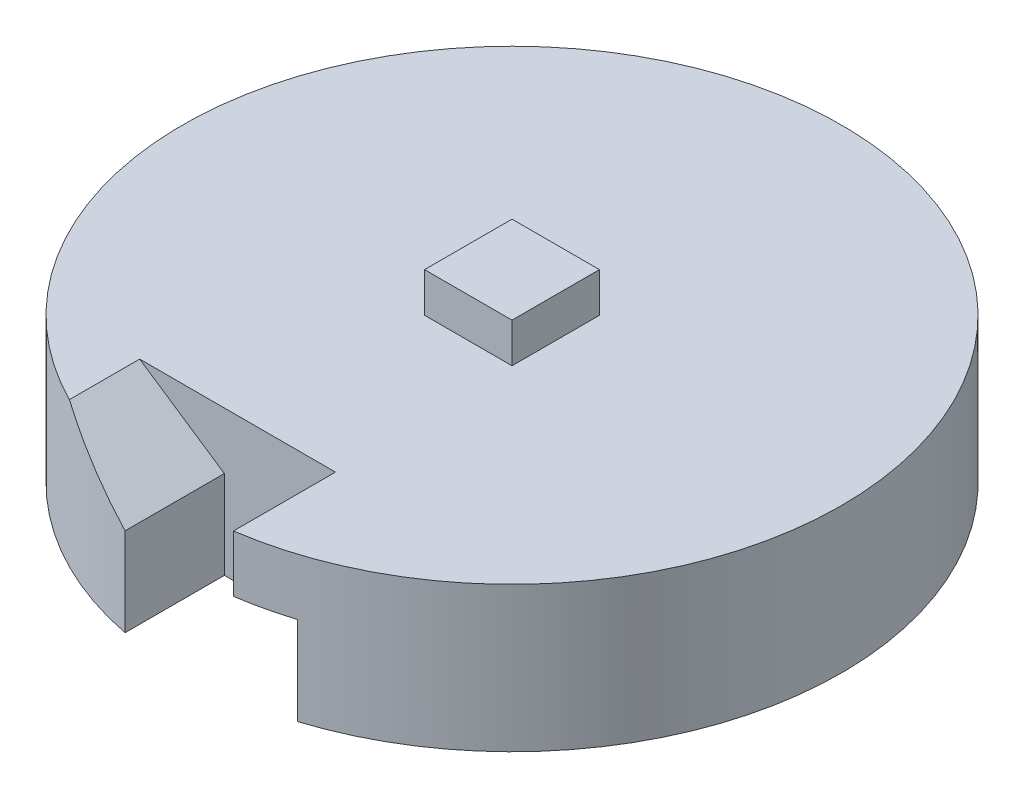
ISO-10303-21;
HEADER;
FILE_DESCRIPTION(('STEP AP214'),'2;1');
FILE_NAME('part.step','',(''),(''),'','','');
FILE_SCHEMA(('AUTOMOTIVE_DESIGN { 1 0 10303 214 1 1 1 1 }'));
ENDSEC;
DATA;
#1=APPLICATION_CONTEXT('core data for automotive mechanical design processes');
#2=APPLICATION_PROTOCOL_DEFINITION('international standard','automotive_design',2000,#1);
#3=PRODUCT_CONTEXT('',#1,'mechanical');
#4=PRODUCT('Part','Part','',(#3));
#5=PRODUCT_RELATED_PRODUCT_CATEGORY('part','',(#4));
#6=PRODUCT_DEFINITION_FORMATION('','',#4);
#7=PRODUCT_DEFINITION_CONTEXT('part definition',#1,'design');
#8=PRODUCT_DEFINITION('design','',#6,#7);
#9=PRODUCT_DEFINITION_SHAPE('','',#8);
#10=(LENGTH_UNIT() NAMED_UNIT(*) SI_UNIT(.MILLI.,.METRE.));
#11=(NAMED_UNIT(*) PLANE_ANGLE_UNIT() SI_UNIT($,.RADIAN.));
#12=(NAMED_UNIT(*) SI_UNIT($,.STERADIAN.) SOLID_ANGLE_UNIT());
#13=UNCERTAINTY_MEASURE_WITH_UNIT(LENGTH_MEASURE(1.E-05),#10,'distance_accuracy_value','');
#14=(GEOMETRIC_REPRESENTATION_CONTEXT(3) GLOBAL_UNCERTAINTY_ASSIGNED_CONTEXT((#13)) GLOBAL_UNIT_ASSIGNED_CONTEXT((#10,
#11,#12)) REPRESENTATION_CONTEXT('',''));
#15=CARTESIAN_POINT('',(0.,0.,0.));
#16=DIRECTION('',(0.,0.,1.));
#17=DIRECTION('',(1.,0.,0.));
#18=AXIS2_PLACEMENT_3D('',#15,#16,#17);
#19=CARTESIAN_POINT('',(0.,16.5,0.));
#20=DIRECTION('',(0.,1.,0.));
#21=DIRECTION('',(0.,0.,1.));
#22=AXIS2_PLACEMENT_3D('',#19,#20,#21);
#23=PLANE('',#22);
#24=DIRECTION('',(0.,0.,-1.));
#25=VECTOR('',#24,1.);
#26=CARTESIAN_POINT('',(5.40916797594821,16.5,0.));
#27=LINE('',#26,#25);
#28=CARTESIAN_POINT('',(5.40916797594821,16.5,37.1078280394848));
#29=VERTEX_POINT('',#28);
#30=CARTESIAN_POINT('',(5.40916797594821,16.5,25.5));
#31=VERTEX_POINT('',#30);
#32=EDGE_CURVE('E54',#29,#31,#27,.T.);
#33=ORIENTED_EDGE('',*,*,#32,.F.);
#34=CARTESIAN_POINT('',(0.,16.5,0.));
#35=DIRECTION('',(0.,1.,0.));
#36=DIRECTION('',(0.,0.,1.));
#37=AXIS2_PLACEMENT_3D('',#34,#35,#36);
#38=CIRCLE('',#37,37.5);
#39=CARTESIAN_POINT('',(-16.8698591452919,16.5,33.4911608102498));
#40=VERTEX_POINT('',#39);
#41=EDGE_CURVE('E224',#29,#40,#38,.T.);
#42=ORIENTED_EDGE('',*,*,#41,.T.);
#43=DIRECTION('',(0.,0.,1.));
#44=VECTOR('',#43,1.);
#45=CARTESIAN_POINT('',(-16.8698591452919,16.5,0.));
#46=LINE('',#45,#44);
#47=CARTESIAN_POINT('',(-16.8698591452919,16.5,25.5));
#48=VERTEX_POINT('',#47);
#49=EDGE_CURVE('E242',#48,#40,#46,.T.);
#50=ORIENTED_EDGE('',*,*,#49,.F.);
#51=DIRECTION('',(1.,0.,0.));
#52=VECTOR('',#51,1.);
#53=CARTESIAN_POINT('',(0.,16.5,25.5));
#54=LINE('',#53,#52);
#55=EDGE_CURVE('E196',#48,#31,#54,.T.);
#56=ORIENTED_EDGE('',*,*,#55,.T.);
#57=EDGE_LOOP('',(#33,#42,#50,#56));
#58=FACE_BOUND('',#57,.T.);
#59=DIRECTION('',(1.,0.,0.));
#60=VECTOR('',#59,1.);
#61=CARTESIAN_POINT('',(0.,16.5,-4.975));
#62=LINE('',#61,#60);
#63=CARTESIAN_POINT('',(-4.975,16.5,-4.975));
#64=VERTEX_POINT('',#63);
#65=CARTESIAN_POINT('',(4.975,16.5,-4.975));
#66=VERTEX_POINT('',#65);
#67=EDGE_CURVE('E170',#64,#66,#62,.T.);
#68=ORIENTED_EDGE('',*,*,#67,.T.);
#69=DIRECTION('',(0.,0.,1.));
#70=VECTOR('',#69,1.);
#71=CARTESIAN_POINT('',(4.975,16.5,0.));
#72=LINE('',#71,#70);
#73=CARTESIAN_POINT('',(4.975,16.5,4.975));
#74=VERTEX_POINT('',#73);
#75=EDGE_CURVE('E155',#66,#74,#72,.T.);
#76=ORIENTED_EDGE('',*,*,#75,.T.);
#77=DIRECTION('',(-1.,0.,0.));
#78=VECTOR('',#77,1.);
#79=CARTESIAN_POINT('',(0.,16.5,4.975));
#80=LINE('',#79,#78);
#81=CARTESIAN_POINT('',(-4.975,16.5,4.975));
#82=VERTEX_POINT('',#81);
#83=EDGE_CURVE('E157',#74,#82,#80,.T.);
#84=ORIENTED_EDGE('',*,*,#83,.T.);
#85=DIRECTION('',(0.,0.,-1.));
#86=VECTOR('',#85,1.);
#87=CARTESIAN_POINT('',(-4.975,16.5,0.));
#88=LINE('',#87,#86);
#89=EDGE_CURVE('E162',#82,#64,#88,.T.);
#90=ORIENTED_EDGE('',*,*,#89,.T.);
#91=EDGE_LOOP('',(#68,#76,#84,#90));
#92=FACE_BOUND('',#91,.T.);
#93=ADVANCED_FACE('F45',(#58,#92),#23,.T.);
#94=CARTESIAN_POINT('',(0.,16.5,0.));
#95=DIRECTION('',(0.,-1.,0.));
#96=DIRECTION('',(0.,0.,-1.));
#97=AXIS2_PLACEMENT_3D('',#94,#95,#96);
#98=CYLINDRICAL_SURFACE('',#97,37.5);
#99=ORIENTED_EDGE('',*,*,#41,.F.);
#100=DIRECTION('',(0.,-1.,0.));
#101=VECTOR('',#100,1.);
#102=CARTESIAN_POINT('',(5.40916797594821,16.5,37.1078280394848));
#103=LINE('',#102,#101);
#104=CARTESIAN_POINT('',(5.40916797594821,10.0586939101936,37.1078280394848));
#105=VERTEX_POINT('',#104);
#106=EDGE_CURVE('E219',#29,#105,#103,.T.);
#107=ORIENTED_EDGE('',*,*,#106,.T.);
#108=CARTESIAN_POINT('',(0.,10.0586939101936,0.));
#109=DIRECTION('',(0.,1.,0.));
#110=DIRECTION('',(0.,0.,1.));
#111=AXIS2_PLACEMENT_3D('',#108,#109,#110);
#112=CIRCLE('',#111,37.5);
#113=CARTESIAN_POINT('',(11.3377548552186,10.0586939101936,35.7450040543146));
#114=VERTEX_POINT('',#113);
#115=EDGE_CURVE('E11',#105,#114,#112,.T.);
#116=ORIENTED_EDGE('',*,*,#115,.T.);
#117=DIRECTION('',(0.,-1.,0.));
#118=VECTOR('',#117,1.);
#119=CARTESIAN_POINT('',(11.3377548552186,16.5,35.7450040543146));
#120=LINE('',#119,#118);
#121=CARTESIAN_POINT('',(11.3377548552186,0.,35.7450040543146));
#122=VERTEX_POINT('',#121);
#123=EDGE_CURVE('E211',#114,#122,#120,.T.);
#124=ORIENTED_EDGE('',*,*,#123,.T.);
#125=CARTESIAN_POINT('',(0.,0.,0.));
#126=DIRECTION('',(0.,1.,0.));
#127=DIRECTION('',(0.,0.,1.));
#128=AXIS2_PLACEMENT_3D('',#125,#126,#127);
#129=CIRCLE('',#128,37.5);
#130=CARTESIAN_POINT('',(-7.23202995206033,0.,36.7960288994954));
#131=VERTEX_POINT('',#130);
#132=EDGE_CURVE('E223',#122,#131,#129,.T.);
#133=ORIENTED_EDGE('',*,*,#132,.T.);
#134=DIRECTION('',(0.,-1.,0.));
#135=VECTOR('',#134,1.);
#136=CARTESIAN_POINT('',(-7.23202995206033,16.5,36.7960288994954));
#137=LINE('',#136,#135);
#138=CARTESIAN_POINT('',(-7.23202995206033,10.0401319165543,36.7960288994954));
#139=VERTEX_POINT('',#138);
#140=EDGE_CURVE('E207',#131,#139,#137,.F.);
#141=ORIENTED_EDGE('',*,*,#140,.T.);
#142=CARTESIAN_POINT('',(0.,5.19277899825944,0.));
#143=DIRECTION('',(-0.556765929579434,-0.830669428629433,0.));
#144=DIRECTION('',(0.830669428629433,-0.556765929579434,0.));
#145=AXIS2_PLACEMENT_3D('',#142,#143,#144);
#146=ELLIPSE('',#145,45.1443121746677,37.5);
#147=EDGE_CURVE('E215',#139,#40,#146,.T.);
#148=ORIENTED_EDGE('',*,*,#147,.T.);
#149=EDGE_LOOP('',(#99,#107,#116,#124,#133,#141,#148));
#150=FACE_BOUND('',#149,.T.);
#151=ADVANCED_FACE('F47',(#150),#98,.T.);
#152=CARTESIAN_POINT('',(0.,0.,0.));
#153=DIRECTION('',(0.,1.,0.));
#154=DIRECTION('',(0.,0.,1.));
#155=AXIS2_PLACEMENT_3D('',#152,#153,#154);
#156=PLANE('',#155);
#157=CARTESIAN_POINT('',(0.,0.,0.));
#158=DIRECTION('',(0.,-1.,0.));
#159=DIRECTION('',(0.,0.,-1.));
#160=AXIS2_PLACEMENT_3D('',#157,#158,#159);
#161=CIRCLE('',#160,5.);
#162=CARTESIAN_POINT('',(0.,0.,-5.));
#163=VERTEX_POINT('',#162);
#164=EDGE_CURVE('E381',#163,#163,#161,.T.);
#165=ORIENTED_EDGE('',*,*,#164,.F.);
#166=EDGE_LOOP('',(#165));
#167=FACE_BOUND('',#166,.T.);
#168=ORIENTED_EDGE('',*,*,#132,.F.);
#169=DIRECTION('',(0.,0.,-1.));
#170=VECTOR('',#169,1.);
#171=CARTESIAN_POINT('',(11.3377548552186,0.,0.));
#172=LINE('',#171,#170);
#173=CARTESIAN_POINT('',(11.3377548552186,0.,25.5));
#174=VERTEX_POINT('',#173);
#175=EDGE_CURVE('E238',#122,#174,#172,.T.);
#176=ORIENTED_EDGE('',*,*,#175,.T.);
#177=DIRECTION('',(1.,0.,0.));
#178=VECTOR('',#177,1.);
#179=CARTESIAN_POINT('',(0.,0.,25.5));
#180=LINE('',#179,#178);
#181=CARTESIAN_POINT('',(-7.23202995206033,0.,25.5));
#182=VERTEX_POINT('',#181);
#183=EDGE_CURVE('E228',#182,#174,#180,.T.);
#184=ORIENTED_EDGE('',*,*,#183,.F.);
#185=DIRECTION('',(0.,0.,1.));
#186=VECTOR('',#185,1.);
#187=CARTESIAN_POINT('',(-7.23202995206033,0.,0.));
#188=LINE('',#187,#186);
#189=EDGE_CURVE('E234',#182,#131,#188,.T.);
#190=ORIENTED_EDGE('',*,*,#189,.T.);
#191=EDGE_LOOP('',(#168,#176,#184,#190));
#192=FACE_BOUND('',#191,.T.);
#193=ADVANCED_FACE('F265',(#167,#192),#156,.F.);
#194=CARTESIAN_POINT('',(5.40916797594821,10.0586939101936,25.5));
#195=DIRECTION('',(0.,1.,0.));
#196=DIRECTION('',(0.,0.,1.));
#197=AXIS2_PLACEMENT_3D('',#194,#195,#196);
#198=PLANE('',#197);
#199=DIRECTION('',(0.,0.,1.));
#200=VECTOR('',#199,1.);
#201=CARTESIAN_POINT('',(5.40916797594821,10.0586939101936,25.5));
#202=LINE('',#201,#200);
#203=CARTESIAN_POINT('',(5.40916797594821,10.0586939101936,25.5));
#204=VERTEX_POINT('',#203);
#205=EDGE_CURVE('E192',#204,#105,#202,.T.);
#206=ORIENTED_EDGE('',*,*,#205,.F.);
#207=DIRECTION('',(-1.,0.,0.));
#208=VECTOR('',#207,1.);
#209=CARTESIAN_POINT('',(5.40916797594821,10.0586939101936,25.5));
#210=LINE('',#209,#208);
#211=CARTESIAN_POINT('',(11.3377548552186,10.0586939101936,25.5));
#212=VERTEX_POINT('',#211);
#213=EDGE_CURVE('E187',#212,#204,#210,.T.);
#214=ORIENTED_EDGE('',*,*,#213,.F.);
#215=DIRECTION('',(0.,0.,1.));
#216=VECTOR('',#215,1.);
#217=CARTESIAN_POINT('',(11.3377548552186,10.0586939101936,25.5));
#218=LINE('',#217,#216);
#219=EDGE_CURVE('E197',#212,#114,#218,.T.);
#220=ORIENTED_EDGE('',*,*,#219,.T.);
#221=ORIENTED_EDGE('',*,*,#115,.F.);
#222=EDGE_LOOP('',(#206,#214,#220,#221));
#223=FACE_BOUND('',#222,.T.);
#224=ADVANCED_FACE('F271',(#223),#198,.F.);
#225=CARTESIAN_POINT('',(5.40916797594821,16.5586939101936,25.5));
#226=DIRECTION('',(1.,0.,0.));
#227=DIRECTION('',(0.,1.,0.));
#228=AXIS2_PLACEMENT_3D('',#225,#226,#227);
#229=PLANE('',#228);
#230=ORIENTED_EDGE('',*,*,#32,.T.);
#231=DIRECTION('',(0.,1.,0.));
#232=VECTOR('',#231,1.);
#233=CARTESIAN_POINT('',(5.40916797594821,16.5586939101936,25.5));
#234=LINE('',#233,#232);
#235=EDGE_CURVE('E175',#204,#31,#234,.T.);
#236=ORIENTED_EDGE('',*,*,#235,.F.);
#237=ORIENTED_EDGE('',*,*,#205,.T.);
#238=ORIENTED_EDGE('',*,*,#106,.F.);
#239=EDGE_LOOP('',(#230,#236,#237,#238));
#240=FACE_BOUND('',#239,.T.);
#241=ADVANCED_FACE('F248',(#240),#229,.F.);
#242=CARTESIAN_POINT('',(-16.9574277881529,16.5586939101936,25.5));
#243=DIRECTION('',(-0.556765929579434,-0.830669428629433,0.));
#244=DIRECTION('',(0.830669428629433,-0.556765929579434,0.));
#245=AXIS2_PLACEMENT_3D('',#242,#243,#244);
#246=PLANE('',#245);
#247=DIRECTION('',(0.,0.,1.));
#248=VECTOR('',#247,1.);
#249=CARTESIAN_POINT('',(-7.23202995206033,10.0401319165543,25.5));
#250=LINE('',#249,#248);
#251=CARTESIAN_POINT('',(-7.23202995206033,10.0401319165543,25.5));
#252=VERTEX_POINT('',#251);
#253=EDGE_CURVE('E191',#252,#139,#250,.T.);
#254=ORIENTED_EDGE('',*,*,#253,.F.);
#255=DIRECTION('',(0.830669428629433,-0.556765929579434,0.));
#256=VECTOR('',#255,1.);
#257=CARTESIAN_POINT('',(-16.9574277881529,16.5586939101936,25.5));
#258=LINE('',#257,#256);
#259=EDGE_CURVE('E179',#48,#252,#258,.T.);
#260=ORIENTED_EDGE('',*,*,#259,.F.);
#261=ORIENTED_EDGE('',*,*,#49,.T.);
#262=ORIENTED_EDGE('',*,*,#147,.F.);
#263=EDGE_LOOP('',(#254,#260,#261,#262));
#264=FACE_BOUND('',#263,.T.);
#265=ADVANCED_FACE('F258',(#264),#246,.F.);
#266=CARTESIAN_POINT('',(11.3377548552186,10.0586939101936,25.5));
#267=DIRECTION('',(1.,0.,0.));
#268=DIRECTION('',(0.,1.,0.));
#269=AXIS2_PLACEMENT_3D('',#266,#267,#268);
#270=PLANE('',#269);
#271=ORIENTED_EDGE('',*,*,#219,.F.);
#272=DIRECTION('',(0.,1.,0.));
#273=VECTOR('',#272,1.);
#274=CARTESIAN_POINT('',(11.3377548552186,10.0586939101936,25.5));
#275=LINE('',#274,#273);
#276=EDGE_CURVE('E184',#174,#212,#275,.T.);
#277=ORIENTED_EDGE('',*,*,#276,.F.);
#278=ORIENTED_EDGE('',*,*,#175,.F.);
#279=ORIENTED_EDGE('',*,*,#123,.F.);
#280=EDGE_LOOP('',(#271,#277,#278,#279));
#281=FACE_BOUND('',#280,.T.);
#282=ADVANCED_FACE('F269',(#281),#270,.F.);
#283=CARTESIAN_POINT('',(-7.23202995206033,10.0401319165543,25.5));
#284=DIRECTION('',(-1.,0.,0.));
#285=DIRECTION('',(0.,0.,1.));
#286=AXIS2_PLACEMENT_3D('',#283,#284,#285);
#287=PLANE('',#286);
#288=ORIENTED_EDGE('',*,*,#189,.F.);
#289=DIRECTION('',(0.,-1.,0.));
#290=VECTOR('',#289,1.);
#291=CARTESIAN_POINT('',(-7.23202995206033,10.0401319165543,25.5));
#292=LINE('',#291,#290);
#293=EDGE_CURVE('E69',#252,#182,#292,.T.);
#294=ORIENTED_EDGE('',*,*,#293,.F.);
#295=ORIENTED_EDGE('',*,*,#253,.T.);
#296=ORIENTED_EDGE('',*,*,#140,.F.);
#297=EDGE_LOOP('',(#288,#294,#295,#296));
#298=FACE_BOUND('',#297,.T.);
#299=ADVANCED_FACE('F262',(#298),#287,.F.);
#300=CARTESIAN_POINT('',(0.,0.,25.5));
#301=DIRECTION('',(0.,0.,1.));
#302=DIRECTION('',(1.,0.,0.));
#303=AXIS2_PLACEMENT_3D('',#300,#301,#302);
#304=PLANE('',#303);
#305=ORIENTED_EDGE('',*,*,#259,.T.);
#306=ORIENTED_EDGE('',*,*,#293,.T.);
#307=ORIENTED_EDGE('',*,*,#183,.T.);
#308=ORIENTED_EDGE('',*,*,#276,.T.);
#309=ORIENTED_EDGE('',*,*,#213,.T.);
#310=ORIENTED_EDGE('',*,*,#235,.T.);
#311=ORIENTED_EDGE('',*,*,#55,.F.);
#312=EDGE_LOOP('',(#305,#306,#307,#308,#309,#310,#311));
#313=FACE_BOUND('',#312,.T.);
#314=ADVANCED_FACE('F251',(#313),#304,.T.);
#315=CARTESIAN_POINT('',(4.975,21.,-4.975));
#316=DIRECTION('',(-1.,0.,0.));
#317=DIRECTION('',(0.,0.,1.));
#318=AXIS2_PLACEMENT_3D('',#315,#316,#317);
#319=PLANE('',#318);
#320=ORIENTED_EDGE('',*,*,#75,.F.);
#321=DIRECTION('',(0.,-1.,0.));
#322=VECTOR('',#321,1.);
#323=CARTESIAN_POINT('',(4.975,21.,-4.975));
#324=LINE('',#323,#322);
#325=CARTESIAN_POINT('',(4.975,21.,-4.975));
#326=VERTEX_POINT('',#325);
#327=EDGE_CURVE('E134',#326,#66,#324,.T.);
#328=ORIENTED_EDGE('',*,*,#327,.F.);
#329=DIRECTION('',(0.,0.,-1.));
#330=VECTOR('',#329,1.);
#331=CARTESIAN_POINT('',(4.975,21.,-4.975));
#332=LINE('',#331,#330);
#333=CARTESIAN_POINT('',(4.975,21.,4.975));
#334=VERTEX_POINT('',#333);
#335=EDGE_CURVE('E142',#334,#326,#332,.T.);
#336=ORIENTED_EDGE('',*,*,#335,.F.);
#337=DIRECTION('',(0.,-1.,0.));
#338=VECTOR('',#337,1.);
#339=CARTESIAN_POINT('',(4.975,21.,4.975));
#340=LINE('',#339,#338);
#341=EDGE_CURVE('E391',#334,#74,#340,.T.);
#342=ORIENTED_EDGE('',*,*,#341,.T.);
#343=EDGE_LOOP('',(#320,#328,#336,#342));
#344=FACE_BOUND('',#343,.T.);
#345=ADVANCED_FACE('F153',(#344),#319,.F.);
#346=CARTESIAN_POINT('',(-4.975,21.,-4.975));
#347=DIRECTION('',(0.,0.,1.));
#348=DIRECTION('',(1.,0.,0.));
#349=AXIS2_PLACEMENT_3D('',#346,#347,#348);
#350=PLANE('',#349);
#351=ORIENTED_EDGE('',*,*,#67,.F.);
#352=DIRECTION('',(0.,-1.,0.));
#353=VECTOR('',#352,1.);
#354=CARTESIAN_POINT('',(-4.975,21.,-4.975));
#355=LINE('',#354,#353);
#356=CARTESIAN_POINT('',(-4.975,21.,-4.975));
#357=VERTEX_POINT('',#356);
#358=EDGE_CURVE('E137',#357,#64,#355,.T.);
#359=ORIENTED_EDGE('',*,*,#358,.F.);
#360=DIRECTION('',(-1.,0.,0.));
#361=VECTOR('',#360,1.);
#362=CARTESIAN_POINT('',(-4.975,21.,-4.975));
#363=LINE('',#362,#361);
#364=EDGE_CURVE('E130',#326,#357,#363,.T.);
#365=ORIENTED_EDGE('',*,*,#364,.F.);
#366=ORIENTED_EDGE('',*,*,#327,.T.);
#367=EDGE_LOOP('',(#351,#359,#365,#366));
#368=FACE_BOUND('',#367,.T.);
#369=ADVANCED_FACE('F132',(#368),#350,.F.);
#370=CARTESIAN_POINT('',(-4.975,21.,-4.975));
#371=DIRECTION('',(1.,0.,0.));
#372=DIRECTION('',(0.,0.,-1.));
#373=AXIS2_PLACEMENT_3D('',#370,#371,#372);
#374=PLANE('',#373);
#375=ORIENTED_EDGE('',*,*,#89,.F.);
#376=DIRECTION('',(0.,-1.,0.));
#377=VECTOR('',#376,1.);
#378=CARTESIAN_POINT('',(-4.975,21.,4.975));
#379=LINE('',#378,#377);
#380=CARTESIAN_POINT('',(-4.975,21.,4.975));
#381=VERTEX_POINT('',#380);
#382=EDGE_CURVE('E61',#381,#82,#379,.T.);
#383=ORIENTED_EDGE('',*,*,#382,.F.);
#384=DIRECTION('',(0.,0.,1.));
#385=VECTOR('',#384,1.);
#386=CARTESIAN_POINT('',(-4.975,21.,-4.975));
#387=LINE('',#386,#385);
#388=EDGE_CURVE('E141',#357,#381,#387,.T.);
#389=ORIENTED_EDGE('',*,*,#388,.F.);
#390=ORIENTED_EDGE('',*,*,#358,.T.);
#391=EDGE_LOOP('',(#375,#383,#389,#390));
#392=FACE_BOUND('',#391,.T.);
#393=ADVANCED_FACE('F329',(#392),#374,.F.);
#394=CARTESIAN_POINT('',(-4.975,21.,4.975));
#395=DIRECTION('',(0.,0.,-1.));
#396=DIRECTION('',(-1.,0.,0.));
#397=AXIS2_PLACEMENT_3D('',#394,#395,#396);
#398=PLANE('',#397);
#399=ORIENTED_EDGE('',*,*,#83,.F.);
#400=ORIENTED_EDGE('',*,*,#341,.F.);
#401=DIRECTION('',(1.,0.,0.));
#402=VECTOR('',#401,1.);
#403=CARTESIAN_POINT('',(-4.975,21.,4.975));
#404=LINE('',#403,#402);
#405=EDGE_CURVE('E146',#381,#334,#404,.T.);
#406=ORIENTED_EDGE('',*,*,#405,.F.);
#407=ORIENTED_EDGE('',*,*,#382,.T.);
#408=EDGE_LOOP('',(#399,#400,#406,#407));
#409=FACE_BOUND('',#408,.T.);
#410=ADVANCED_FACE('F338',(#409),#398,.F.);
#411=CARTESIAN_POINT('',(0.,21.,0.));
#412=DIRECTION('',(0.,1.,0.));
#413=DIRECTION('',(0.,0.,1.));
#414=AXIS2_PLACEMENT_3D('',#411,#412,#413);
#415=PLANE('',#414);
#416=ORIENTED_EDGE('',*,*,#335,.T.);
#417=ORIENTED_EDGE('',*,*,#364,.T.);
#418=ORIENTED_EDGE('',*,*,#388,.T.);
#419=ORIENTED_EDGE('',*,*,#405,.T.);
#420=EDGE_LOOP('',(#416,#417,#418,#419));
#421=FACE_BOUND('',#420,.T.);
#422=ADVANCED_FACE('F145',(#421),#415,.T.);
#423=CARTESIAN_POINT('',(0.,8.,0.));
#424=DIRECTION('',(0.,-1.,0.));
#425=DIRECTION('',(0.,0.,-1.));
#426=AXIS2_PLACEMENT_3D('',#423,#424,#425);
#427=CYLINDRICAL_SURFACE('',#426,5.);
#428=CARTESIAN_POINT('',(0.,8.,0.));
#429=DIRECTION('',(0.,-1.,0.));
#430=DIRECTION('',(0.,0.,-1.));
#431=AXIS2_PLACEMENT_3D('',#428,#429,#430);
#432=CIRCLE('',#431,5.);
#433=CARTESIAN_POINT('',(0.,8.,-5.));
#434=VERTEX_POINT('',#433);
#435=EDGE_CURVE('E151',#434,#434,#432,.T.);
#436=ORIENTED_EDGE('',*,*,#435,.F.);
#437=EDGE_LOOP('',(#436));
#438=FACE_BOUND('',#437,.T.);
#439=ORIENTED_EDGE('',*,*,#164,.T.);
#440=EDGE_LOOP('',(#439));
#441=FACE_BOUND('',#440,.T.);
#442=ADVANCED_FACE('F356',(#438,#441),#427,.F.);
#443=CARTESIAN_POINT('',(0.,8.,0.));
#444=DIRECTION('',(0.,-1.,0.));
#445=DIRECTION('',(0.,0.,-1.));
#446=AXIS2_PLACEMENT_3D('',#443,#444,#445);
#447=PLANE('',#446);
#448=ORIENTED_EDGE('',*,*,#435,.T.);
#449=EDGE_LOOP('',(#448));
#450=FACE_BOUND('',#449,.T.);
#451=ADVANCED_FACE('F365',(#450),#447,.T.);
#452=CLOSED_SHELL('',(#93,#151,#193,#224,#241,#265,#282,#299,#314,#345,#369,#393,#410,#422,#442,#451));
#453=MANIFOLD_SOLID_BREP('B2',#452);
#454=ADVANCED_BREP_SHAPE_REPRESENTATION('',(#18,#453),#14);
#455=SHAPE_DEFINITION_REPRESENTATION(#9,#454);
ENDSEC;
END-ISO-10303-21;
